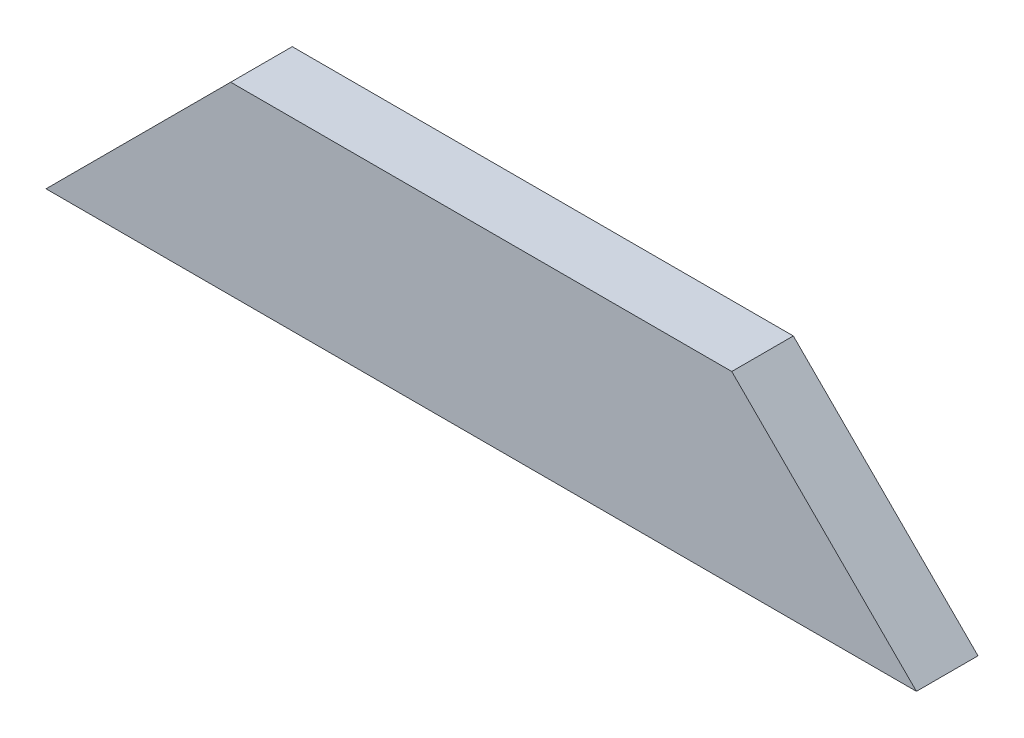
ISO-10303-21;
HEADER;
FILE_DESCRIPTION(('STEP AP214'),'2;1');
FILE_NAME('part.step','',(''),(''),'','','');
FILE_SCHEMA(('AUTOMOTIVE_DESIGN { 1 0 10303 214 1 1 1 1 }'));
ENDSEC;
DATA;
#1=APPLICATION_CONTEXT('core data for automotive mechanical design processes');
#2=APPLICATION_PROTOCOL_DEFINITION('international standard','automotive_design',2000,#1);
#3=PRODUCT_CONTEXT('',#1,'mechanical');
#4=PRODUCT('Part','Part','',(#3));
#5=PRODUCT_RELATED_PRODUCT_CATEGORY('part','',(#4));
#6=PRODUCT_DEFINITION_FORMATION('','',#4);
#7=PRODUCT_DEFINITION_CONTEXT('part definition',#1,'design');
#8=PRODUCT_DEFINITION('design','',#6,#7);
#9=PRODUCT_DEFINITION_SHAPE('','',#8);
#10=(LENGTH_UNIT() NAMED_UNIT(*) SI_UNIT(.MILLI.,.METRE.));
#11=(NAMED_UNIT(*) PLANE_ANGLE_UNIT() SI_UNIT($,.RADIAN.));
#12=(NAMED_UNIT(*) SI_UNIT($,.STERADIAN.) SOLID_ANGLE_UNIT());
#13=UNCERTAINTY_MEASURE_WITH_UNIT(LENGTH_MEASURE(1.E-05),#10,'distance_accuracy_value','');
#14=(GEOMETRIC_REPRESENTATION_CONTEXT(3) GLOBAL_UNCERTAINTY_ASSIGNED_CONTEXT((#13)) GLOBAL_UNIT_ASSIGNED_CONTEXT((#10,
#11,#12)) REPRESENTATION_CONTEXT('',''));
#15=CARTESIAN_POINT('',(0.,0.,0.));
#16=DIRECTION('',(0.,0.,1.));
#17=DIRECTION('',(1.,0.,0.));
#18=AXIS2_PLACEMENT_3D('',#15,#16,#17);
#19=CARTESIAN_POINT('',(203.5,75.,25.));
#20=DIRECTION('',(-0.707106781186549,-0.707106781186546,0.));
#21=DIRECTION('',(0.707106781186546,-0.707106781186549,0.));
#22=AXIS2_PLACEMENT_3D('',#19,#20,#21);
#23=PLANE('',#22);
#24=DIRECTION('',(-0.707106781186546,0.707106781186549,0.));
#25=VECTOR('',#24,1.);
#26=CARTESIAN_POINT('',(203.5,75.,-25.));
#27=LINE('',#26,#25);
#28=CARTESIAN_POINT('',(353.5,-75.,-25.));
#29=VERTEX_POINT('',#28);
#30=CARTESIAN_POINT('',(203.5,75.,-25.));
#31=VERTEX_POINT('',#30);
#32=EDGE_CURVE('E111',#29,#31,#27,.T.);
#33=ORIENTED_EDGE('',*,*,#32,.T.);
#34=DIRECTION('',(0.,0.,-1.));
#35=VECTOR('',#34,1.);
#36=CARTESIAN_POINT('',(203.5,75.,25.));
#37=LINE('',#36,#35);
#38=CARTESIAN_POINT('',(203.5,75.,25.));
#39=VERTEX_POINT('',#38);
#40=EDGE_CURVE('E11',#39,#31,#37,.T.);
#41=ORIENTED_EDGE('',*,*,#40,.F.);
#42=DIRECTION('',(-0.707106781186546,0.707106781186549,0.));
#43=VECTOR('',#42,1.);
#44=CARTESIAN_POINT('',(203.5,75.,25.));
#45=LINE('',#44,#43);
#46=CARTESIAN_POINT('',(353.5,-75.,25.));
#47=VERTEX_POINT('',#46);
#48=EDGE_CURVE('E100',#47,#39,#45,.T.);
#49=ORIENTED_EDGE('',*,*,#48,.F.);
#50=DIRECTION('',(0.,0.,-1.));
#51=VECTOR('',#50,1.);
#52=CARTESIAN_POINT('',(353.5,-75.,25.));
#53=LINE('',#52,#51);
#54=EDGE_CURVE('E109',#47,#29,#53,.T.);
#55=ORIENTED_EDGE('',*,*,#54,.T.);
#56=EDGE_LOOP('',(#33,#41,#49,#55));
#57=FACE_BOUND('',#56,.T.);
#58=ADVANCED_FACE('F44',(#57),#23,.F.);
#59=CARTESIAN_POINT('',(-203.500000000001,75.,25.));
#60=DIRECTION('',(0.,-1.,0.));
#61=DIRECTION('',(0.,0.,-1.));
#62=AXIS2_PLACEMENT_3D('',#59,#60,#61);
#63=PLANE('',#62);
#64=DIRECTION('',(-1.,0.,0.));
#65=VECTOR('',#64,1.);
#66=CARTESIAN_POINT('',(-203.500000000001,75.,-25.));
#67=LINE('',#66,#65);
#68=CARTESIAN_POINT('',(-203.500000000001,75.,-25.));
#69=VERTEX_POINT('',#68);
#70=EDGE_CURVE('E105',#31,#69,#67,.T.);
#71=ORIENTED_EDGE('',*,*,#70,.T.);
#72=DIRECTION('',(0.,0.,-1.));
#73=VECTOR('',#72,1.);
#74=CARTESIAN_POINT('',(-203.500000000001,75.,25.));
#75=LINE('',#74,#73);
#76=CARTESIAN_POINT('',(-203.500000000001,75.,25.));
#77=VERTEX_POINT('',#76);
#78=EDGE_CURVE('E53',#77,#69,#75,.T.);
#79=ORIENTED_EDGE('',*,*,#78,.F.);
#80=DIRECTION('',(-1.,0.,0.));
#81=VECTOR('',#80,1.);
#82=CARTESIAN_POINT('',(-203.500000000001,75.,25.));
#83=LINE('',#82,#81);
#84=EDGE_CURVE('E95',#39,#77,#83,.T.);
#85=ORIENTED_EDGE('',*,*,#84,.F.);
#86=ORIENTED_EDGE('',*,*,#40,.T.);
#87=EDGE_LOOP('',(#71,#79,#85,#86));
#88=FACE_BOUND('',#87,.T.);
#89=ADVANCED_FACE('F102',(#88),#63,.F.);
#90=CARTESIAN_POINT('',(-353.5,-75.,25.));
#91=DIRECTION('',(0.707106781186549,-0.707106781186546,0.));
#92=DIRECTION('',(0.707106781186546,0.707106781186549,0.));
#93=AXIS2_PLACEMENT_3D('',#90,#91,#92);
#94=PLANE('',#93);
#95=DIRECTION('',(-0.707106781186546,-0.707106781186549,0.));
#96=VECTOR('',#95,1.);
#97=CARTESIAN_POINT('',(-353.5,-75.,-25.));
#98=LINE('',#97,#96);
#99=CARTESIAN_POINT('',(-353.5,-75.,-25.));
#100=VERTEX_POINT('',#99);
#101=EDGE_CURVE('E80',#69,#100,#98,.T.);
#102=ORIENTED_EDGE('',*,*,#101,.T.);
#103=DIRECTION('',(0.,0.,-1.));
#104=VECTOR('',#103,1.);
#105=CARTESIAN_POINT('',(-353.5,-75.,25.));
#106=LINE('',#105,#104);
#107=CARTESIAN_POINT('',(-353.5,-75.,25.));
#108=VERTEX_POINT('',#107);
#109=EDGE_CURVE('E101',#108,#100,#106,.T.);
#110=ORIENTED_EDGE('',*,*,#109,.F.);
#111=DIRECTION('',(-0.707106781186546,-0.707106781186549,0.));
#112=VECTOR('',#111,1.);
#113=CARTESIAN_POINT('',(-353.5,-75.,25.));
#114=LINE('',#113,#112);
#115=EDGE_CURVE('E94',#77,#108,#114,.T.);
#116=ORIENTED_EDGE('',*,*,#115,.F.);
#117=ORIENTED_EDGE('',*,*,#78,.T.);
#118=EDGE_LOOP('',(#102,#110,#116,#117));
#119=FACE_BOUND('',#118,.T.);
#120=ADVANCED_FACE('F103',(#119),#94,.F.);
#121=CARTESIAN_POINT('',(-353.5,-75.,25.));
#122=DIRECTION('',(0.,1.,0.));
#123=DIRECTION('',(0.,0.,1.));
#124=AXIS2_PLACEMENT_3D('',#121,#122,#123);
#125=PLANE('',#124);
#126=DIRECTION('',(1.,0.,0.));
#127=VECTOR('',#126,1.);
#128=CARTESIAN_POINT('',(-353.5,-75.,-25.));
#129=LINE('',#128,#127);
#130=EDGE_CURVE('E82',#100,#29,#129,.T.);
#131=ORIENTED_EDGE('',*,*,#130,.T.);
#132=ORIENTED_EDGE('',*,*,#54,.F.);
#133=DIRECTION('',(1.,0.,0.));
#134=VECTOR('',#133,1.);
#135=CARTESIAN_POINT('',(-353.5,-75.,25.));
#136=LINE('',#135,#134);
#137=EDGE_CURVE('E65',#108,#47,#136,.T.);
#138=ORIENTED_EDGE('',*,*,#137,.F.);
#139=ORIENTED_EDGE('',*,*,#109,.T.);
#140=EDGE_LOOP('',(#131,#132,#138,#139));
#141=FACE_BOUND('',#140,.T.);
#142=ADVANCED_FACE('F128',(#141),#125,.F.);
#143=CARTESIAN_POINT('',(0.,0.,25.));
#144=DIRECTION('',(0.,0.,1.));
#145=DIRECTION('',(1.,0.,0.));
#146=AXIS2_PLACEMENT_3D('',#143,#144,#145);
#147=PLANE('',#146);
#148=ORIENTED_EDGE('',*,*,#48,.T.);
#149=ORIENTED_EDGE('',*,*,#84,.T.);
#150=ORIENTED_EDGE('',*,*,#115,.T.);
#151=ORIENTED_EDGE('',*,*,#137,.T.);
#152=EDGE_LOOP('',(#148,#149,#150,#151));
#153=FACE_BOUND('',#152,.T.);
#154=ADVANCED_FACE('F93',(#153),#147,.T.);
#155=CARTESIAN_POINT('',(0.,0.,-25.));
#156=DIRECTION('',(0.,0.,1.));
#157=DIRECTION('',(1.,0.,0.));
#158=AXIS2_PLACEMENT_3D('',#155,#156,#157);
#159=PLANE('',#158);
#160=ORIENTED_EDGE('',*,*,#32,.F.);
#161=ORIENTED_EDGE('',*,*,#130,.F.);
#162=ORIENTED_EDGE('',*,*,#101,.F.);
#163=ORIENTED_EDGE('',*,*,#70,.F.);
#164=EDGE_LOOP('',(#160,#161,#162,#163));
#165=FACE_BOUND('',#164,.T.);
#166=ADVANCED_FACE('F129',(#165),#159,.F.);
#167=CLOSED_SHELL('',(#58,#89,#120,#142,#154,#166));
#168=MANIFOLD_SOLID_BREP('B2',#167);
#169=ADVANCED_BREP_SHAPE_REPRESENTATION('',(#18,#168),#14);
#170=SHAPE_DEFINITION_REPRESENTATION(#9,#169);
ENDSEC;
END-ISO-10303-21;
